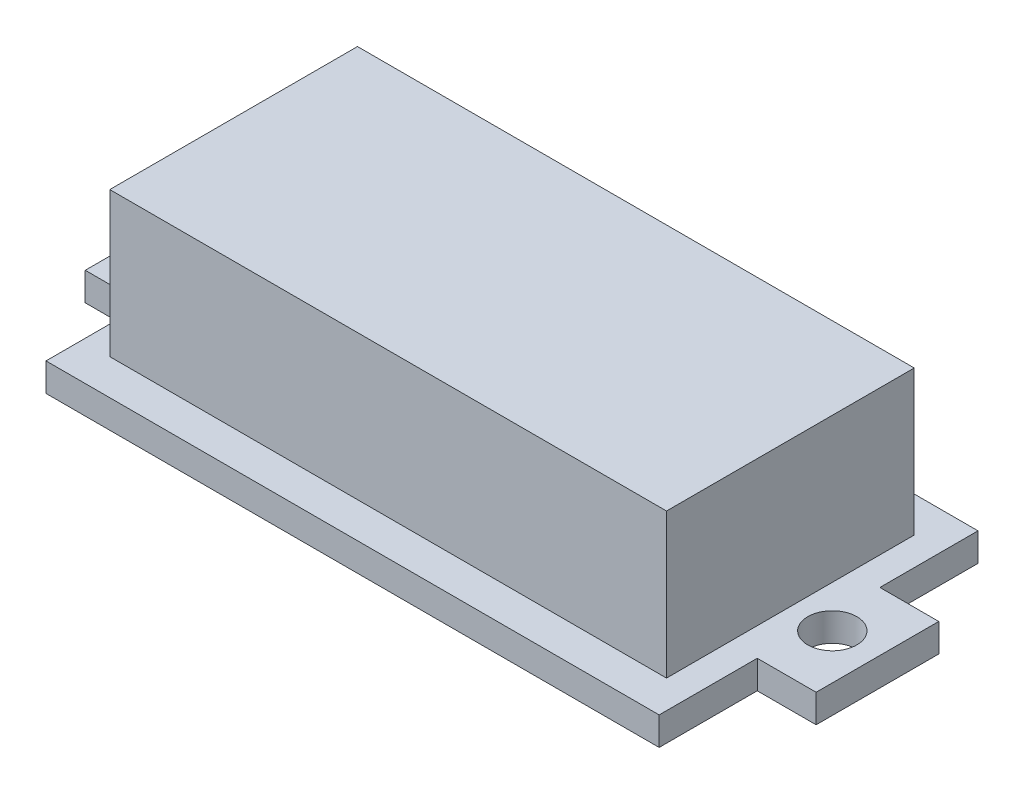
ISO-10303-21;
HEADER;
FILE_DESCRIPTION(('STEP AP214'),'2;1');
FILE_NAME('part.step','',(''),(''),'','','');
FILE_SCHEMA(('AUTOMOTIVE_DESIGN { 1 0 10303 214 1 1 1 1 }'));
ENDSEC;
DATA;
#1=APPLICATION_CONTEXT('core data for automotive mechanical design processes');
#2=APPLICATION_PROTOCOL_DEFINITION('international standard','automotive_design',2000,#1);
#3=PRODUCT_CONTEXT('',#1,'mechanical');
#4=PRODUCT('Part','Part','',(#3));
#5=PRODUCT_RELATED_PRODUCT_CATEGORY('part','',(#4));
#6=PRODUCT_DEFINITION_FORMATION('','',#4);
#7=PRODUCT_DEFINITION_CONTEXT('part definition',#1,'design');
#8=PRODUCT_DEFINITION('design','',#6,#7);
#9=PRODUCT_DEFINITION_SHAPE('','',#8);
#10=(LENGTH_UNIT() NAMED_UNIT(*) SI_UNIT(.MILLI.,.METRE.));
#11=(NAMED_UNIT(*) PLANE_ANGLE_UNIT() SI_UNIT($,.RADIAN.));
#12=(NAMED_UNIT(*) SI_UNIT($,.STERADIAN.) SOLID_ANGLE_UNIT());
#13=UNCERTAINTY_MEASURE_WITH_UNIT(LENGTH_MEASURE(1.E-05),#10,'distance_accuracy_value','');
#14=(GEOMETRIC_REPRESENTATION_CONTEXT(3) GLOBAL_UNCERTAINTY_ASSIGNED_CONTEXT((#13)) GLOBAL_UNIT_ASSIGNED_CONTEXT((#10,
#11,#12)) REPRESENTATION_CONTEXT('',''));
#15=CARTESIAN_POINT('',(0.,0.,0.));
#16=DIRECTION('',(0.,0.,1.));
#17=DIRECTION('',(1.,0.,0.));
#18=AXIS2_PLACEMENT_3D('',#15,#16,#17);
#19=CARTESIAN_POINT('',(0.,1.15,0.));
#20=DIRECTION('',(0.,1.,0.));
#21=DIRECTION('',(0.,0.,1.));
#22=AXIS2_PLACEMENT_3D('',#19,#20,#21);
#23=PLANE('',#22);
#24=DIRECTION('',(0.,0.,-1.));
#25=VECTOR('',#24,1.);
#26=CARTESIAN_POINT('',(11.35,1.15,5.05));
#27=LINE('',#26,#25);
#28=CARTESIAN_POINT('',(11.35,1.15,5.05));
#29=VERTEX_POINT('',#28);
#30=CARTESIAN_POINT('',(11.35,1.15,-5.05));
#31=VERTEX_POINT('',#30);
#32=EDGE_CURVE('E198',#29,#31,#27,.T.);
#33=ORIENTED_EDGE('',*,*,#32,.F.);
#34=DIRECTION('',(1.,0.,0.));
#35=VECTOR('',#34,1.);
#36=CARTESIAN_POINT('',(-11.35,1.15,5.05));
#37=LINE('',#36,#35);
#38=CARTESIAN_POINT('',(-11.35,1.15,5.05));
#39=VERTEX_POINT('',#38);
#40=EDGE_CURVE('E203',#39,#29,#37,.T.);
#41=ORIENTED_EDGE('',*,*,#40,.F.);
#42=DIRECTION('',(0.,0.,1.));
#43=VECTOR('',#42,1.);
#44=CARTESIAN_POINT('',(-11.35,1.15,5.05));
#45=LINE('',#44,#43);
#46=CARTESIAN_POINT('',(-11.35,1.15,-5.05));
#47=VERTEX_POINT('',#46);
#48=EDGE_CURVE('E215',#47,#39,#45,.T.);
#49=ORIENTED_EDGE('',*,*,#48,.F.);
#50=DIRECTION('',(-1.,0.,0.));
#51=VECTOR('',#50,1.);
#52=CARTESIAN_POINT('',(-11.35,1.15,-5.05));
#53=LINE('',#52,#51);
#54=EDGE_CURVE('E212',#31,#47,#53,.T.);
#55=ORIENTED_EDGE('',*,*,#54,.F.);
#56=EDGE_LOOP('',(#33,#41,#49,#55));
#57=FACE_BOUND('',#56,.T.);
#58=CARTESIAN_POINT('',(13.06,1.15,0.));
#59=DIRECTION('',(0.,1.,0.));
#60=DIRECTION('',(0.,0.,1.));
#61=AXIS2_PLACEMENT_3D('',#58,#59,#60);
#62=CIRCLE('',#61,1.);
#63=CARTESIAN_POINT('',(13.06,1.15,1.));
#64=VERTEX_POINT('',#63);
#65=EDGE_CURVE('E238',#64,#64,#62,.T.);
#66=ORIENTED_EDGE('',*,*,#65,.F.);
#67=EDGE_LOOP('',(#66));
#68=FACE_BOUND('',#67,.T.);
#69=DIRECTION('',(0.,0.,-1.));
#70=VECTOR('',#69,1.);
#71=CARTESIAN_POINT('',(12.5,1.15,-6.50000000000001));
#72=LINE('',#71,#70);
#73=CARTESIAN_POINT('',(12.5,1.15,-2.50000000000001));
#74=VERTEX_POINT('',#73);
#75=CARTESIAN_POINT('',(12.5,1.15,-6.50000000000001));
#76=VERTEX_POINT('',#75);
#77=EDGE_CURVE('E244',#74,#76,#72,.T.);
#78=ORIENTED_EDGE('',*,*,#77,.T.);
#79=DIRECTION('',(-1.,0.,0.));
#80=VECTOR('',#79,1.);
#81=CARTESIAN_POINT('',(-12.5,1.15,-6.5));
#82=LINE('',#81,#80);
#83=CARTESIAN_POINT('',(-12.5,1.15,-6.5));
#84=VERTEX_POINT('',#83);
#85=EDGE_CURVE('E247',#76,#84,#82,.T.);
#86=ORIENTED_EDGE('',*,*,#85,.T.);
#87=DIRECTION('',(0.,0.,1.));
#88=VECTOR('',#87,1.);
#89=CARTESIAN_POINT('',(-12.5,1.15,-2.5));
#90=LINE('',#89,#88);
#91=CARTESIAN_POINT('',(-12.5,1.15,-2.5));
#92=VERTEX_POINT('',#91);
#93=EDGE_CURVE('E250',#84,#92,#90,.T.);
#94=ORIENTED_EDGE('',*,*,#93,.T.);
#95=DIRECTION('',(-1.,0.,0.));
#96=VECTOR('',#95,1.);
#97=CARTESIAN_POINT('',(-14.9,1.15,-2.50000000000001));
#98=LINE('',#97,#96);
#99=CARTESIAN_POINT('',(-14.9,1.15,-2.50000000000001));
#100=VERTEX_POINT('',#99);
#101=EDGE_CURVE('E252',#92,#100,#98,.T.);
#102=ORIENTED_EDGE('',*,*,#101,.T.);
#103=DIRECTION('',(0.,0.,1.));
#104=VECTOR('',#103,1.);
#105=CARTESIAN_POINT('',(-14.9,1.15,2.50000000000001));
#106=LINE('',#105,#104);
#107=CARTESIAN_POINT('',(-14.9,1.15,2.50000000000001));
#108=VERTEX_POINT('',#107);
#109=EDGE_CURVE('E254',#100,#108,#106,.T.);
#110=ORIENTED_EDGE('',*,*,#109,.T.);
#111=DIRECTION('',(1.,0.,0.));
#112=VECTOR('',#111,1.);
#113=CARTESIAN_POINT('',(-12.5,1.15,2.5));
#114=LINE('',#113,#112);
#115=CARTESIAN_POINT('',(-12.5,1.15,2.5));
#116=VERTEX_POINT('',#115);
#117=EDGE_CURVE('E256',#108,#116,#114,.T.);
#118=ORIENTED_EDGE('',*,*,#117,.T.);
#119=DIRECTION('',(0.,0.,1.));
#120=VECTOR('',#119,1.);
#121=CARTESIAN_POINT('',(-12.5,1.15,6.5));
#122=LINE('',#121,#120);
#123=CARTESIAN_POINT('',(-12.5,1.15,6.5));
#124=VERTEX_POINT('',#123);
#125=EDGE_CURVE('E258',#116,#124,#122,.T.);
#126=ORIENTED_EDGE('',*,*,#125,.T.);
#127=DIRECTION('',(1.,0.,0.));
#128=VECTOR('',#127,1.);
#129=CARTESIAN_POINT('',(12.5,1.15,6.49999999999999));
#130=LINE('',#129,#128);
#131=CARTESIAN_POINT('',(12.5,1.15,6.49999999999999));
#132=VERTEX_POINT('',#131);
#133=EDGE_CURVE('E260',#124,#132,#130,.T.);
#134=ORIENTED_EDGE('',*,*,#133,.T.);
#135=DIRECTION('',(0.,0.,-1.));
#136=VECTOR('',#135,1.);
#137=CARTESIAN_POINT('',(12.5,1.15,2.5));
#138=LINE('',#137,#136);
#139=CARTESIAN_POINT('',(12.5,1.15,2.5));
#140=VERTEX_POINT('',#139);
#141=EDGE_CURVE('E262',#132,#140,#138,.T.);
#142=ORIENTED_EDGE('',*,*,#141,.T.);
#143=DIRECTION('',(1.,0.,0.));
#144=VECTOR('',#143,1.);
#145=CARTESIAN_POINT('',(14.9,1.15,2.5));
#146=LINE('',#145,#144);
#147=CARTESIAN_POINT('',(14.9,1.15,2.5));
#148=VERTEX_POINT('',#147);
#149=EDGE_CURVE('E264',#140,#148,#146,.T.);
#150=ORIENTED_EDGE('',*,*,#149,.T.);
#151=DIRECTION('',(0.,0.,-1.));
#152=VECTOR('',#151,1.);
#153=CARTESIAN_POINT('',(14.9,1.15,-2.50000000000002));
#154=LINE('',#153,#152);
#155=CARTESIAN_POINT('',(14.9,1.15,-2.50000000000002));
#156=VERTEX_POINT('',#155);
#157=EDGE_CURVE('E266',#148,#156,#154,.T.);
#158=ORIENTED_EDGE('',*,*,#157,.T.);
#159=DIRECTION('',(-1.,0.,0.));
#160=VECTOR('',#159,1.);
#161=CARTESIAN_POINT('',(12.5,1.15,-2.50000000000001));
#162=LINE('',#161,#160);
#163=EDGE_CURVE('E268',#156,#74,#162,.T.);
#164=ORIENTED_EDGE('',*,*,#163,.T.);
#165=EDGE_LOOP('',(#78,#86,#94,#102,#110,#118,#126,#134,#142,#150,#158,#164));
#166=FACE_BOUND('',#165,.T.);
#167=CARTESIAN_POINT('',(-13.06,1.15,0.));
#168=DIRECTION('',(0.,1.,0.));
#169=DIRECTION('',(0.,0.,1.));
#170=AXIS2_PLACEMENT_3D('',#167,#168,#169);
#171=CIRCLE('',#170,1.);
#172=CARTESIAN_POINT('',(-13.06,1.15,1.));
#173=VERTEX_POINT('',#172);
#174=EDGE_CURVE('E232',#173,#173,#171,.T.);
#175=ORIENTED_EDGE('',*,*,#174,.F.);
#176=EDGE_LOOP('',(#175));
#177=FACE_BOUND('',#176,.T.);
#178=ADVANCED_FACE('F34',(#57,#68,#166,#177),#23,.T.);
#179=CARTESIAN_POINT('',(0.,0.,0.));
#180=DIRECTION('',(0.,1.,0.));
#181=DIRECTION('',(0.,0.,1.));
#182=AXIS2_PLACEMENT_3D('',#179,#180,#181);
#183=PLANE('',#182);
#184=DIRECTION('',(-1.,0.,0.));
#185=VECTOR('',#184,1.);
#186=CARTESIAN_POINT('',(0.,0.,-6.));
#187=LINE('',#186,#185);
#188=CARTESIAN_POINT('',(-5.67,0.,-6.));
#189=VERTEX_POINT('',#188);
#190=CARTESIAN_POINT('',(-7.03,0.,-6.));
#191=VERTEX_POINT('',#190);
#192=EDGE_CURVE('E11',#189,#191,#187,.T.);
#193=ORIENTED_EDGE('',*,*,#192,.F.);
#194=DIRECTION('',(0.,0.,-1.));
#195=VECTOR('',#194,1.);
#196=CARTESIAN_POINT('',(-5.67,0.,-6.));
#197=LINE('',#196,#195);
#198=CARTESIAN_POINT('',(-5.67,0.,-6.5));
#199=VERTEX_POINT('',#198);
#200=EDGE_CURVE('E178',#189,#199,#197,.T.);
#201=ORIENTED_EDGE('',*,*,#200,.T.);
#202=DIRECTION('',(-1.,0.,0.));
#203=VECTOR('',#202,1.);
#204=CARTESIAN_POINT('',(-12.5,0.,-6.5));
#205=LINE('',#204,#203);
#206=CARTESIAN_POINT('',(12.5,0.,-6.50000000000001));
#207=VERTEX_POINT('',#206);
#208=EDGE_CURVE('E274',#207,#199,#205,.T.);
#209=ORIENTED_EDGE('',*,*,#208,.F.);
#210=DIRECTION('',(0.,0.,-1.));
#211=VECTOR('',#210,1.);
#212=CARTESIAN_POINT('',(12.5,0.,-6.50000000000001));
#213=LINE('',#212,#211);
#214=CARTESIAN_POINT('',(12.5,0.,-2.50000000000001));
#215=VERTEX_POINT('',#214);
#216=EDGE_CURVE('E241',#215,#207,#213,.T.);
#217=ORIENTED_EDGE('',*,*,#216,.F.);
#218=DIRECTION('',(-1.,0.,0.));
#219=VECTOR('',#218,1.);
#220=CARTESIAN_POINT('',(12.5,0.,-2.50000000000001));
#221=LINE('',#220,#219);
#222=CARTESIAN_POINT('',(14.9,0.,-2.50000000000002));
#223=VERTEX_POINT('',#222);
#224=EDGE_CURVE('E248',#223,#215,#221,.T.);
#225=ORIENTED_EDGE('',*,*,#224,.F.);
#226=DIRECTION('',(0.,0.,-1.));
#227=VECTOR('',#226,1.);
#228=CARTESIAN_POINT('',(14.9,0.,-2.50000000000002));
#229=LINE('',#228,#227);
#230=CARTESIAN_POINT('',(14.9,0.,2.5));
#231=VERTEX_POINT('',#230);
#232=EDGE_CURVE('E293',#231,#223,#229,.T.);
#233=ORIENTED_EDGE('',*,*,#232,.F.);
#234=DIRECTION('',(1.,0.,0.));
#235=VECTOR('',#234,1.);
#236=CARTESIAN_POINT('',(14.9,0.,2.5));
#237=LINE('',#236,#235);
#238=CARTESIAN_POINT('',(12.5,0.,2.5));
#239=VERTEX_POINT('',#238);
#240=EDGE_CURVE('E291',#239,#231,#237,.T.);
#241=ORIENTED_EDGE('',*,*,#240,.F.);
#242=DIRECTION('',(0.,0.,-1.));
#243=VECTOR('',#242,1.);
#244=CARTESIAN_POINT('',(12.5,0.,2.5));
#245=LINE('',#244,#243);
#246=CARTESIAN_POINT('',(12.5,0.,6.49999999999999));
#247=VERTEX_POINT('',#246);
#248=EDGE_CURVE('E289',#247,#239,#245,.T.);
#249=ORIENTED_EDGE('',*,*,#248,.F.);
#250=DIRECTION('',(1.,0.,0.));
#251=VECTOR('',#250,1.);
#252=CARTESIAN_POINT('',(12.5,0.,6.49999999999999));
#253=LINE('',#252,#251);
#254=CARTESIAN_POINT('',(-12.5,0.,6.5));
#255=VERTEX_POINT('',#254);
#256=EDGE_CURVE('E287',#255,#247,#253,.T.);
#257=ORIENTED_EDGE('',*,*,#256,.F.);
#258=DIRECTION('',(0.,0.,1.));
#259=VECTOR('',#258,1.);
#260=CARTESIAN_POINT('',(-12.5,0.,6.5));
#261=LINE('',#260,#259);
#262=CARTESIAN_POINT('',(-12.5,0.,2.5));
#263=VERTEX_POINT('',#262);
#264=EDGE_CURVE('E285',#263,#255,#261,.T.);
#265=ORIENTED_EDGE('',*,*,#264,.F.);
#266=DIRECTION('',(1.,0.,0.));
#267=VECTOR('',#266,1.);
#268=CARTESIAN_POINT('',(-12.5,0.,2.5));
#269=LINE('',#268,#267);
#270=CARTESIAN_POINT('',(-14.9,0.,2.50000000000001));
#271=VERTEX_POINT('',#270);
#272=EDGE_CURVE('E283',#271,#263,#269,.T.);
#273=ORIENTED_EDGE('',*,*,#272,.F.);
#274=DIRECTION('',(0.,0.,1.));
#275=VECTOR('',#274,1.);
#276=CARTESIAN_POINT('',(-14.9,0.,2.50000000000001));
#277=LINE('',#276,#275);
#278=CARTESIAN_POINT('',(-14.9,0.,-2.50000000000001));
#279=VERTEX_POINT('',#278);
#280=EDGE_CURVE('E281',#279,#271,#277,.T.);
#281=ORIENTED_EDGE('',*,*,#280,.F.);
#282=DIRECTION('',(-1.,0.,0.));
#283=VECTOR('',#282,1.);
#284=CARTESIAN_POINT('',(-14.9,0.,-2.50000000000001));
#285=LINE('',#284,#283);
#286=CARTESIAN_POINT('',(-12.5,0.,-2.5));
#287=VERTEX_POINT('',#286);
#288=EDGE_CURVE('E279',#287,#279,#285,.T.);
#289=ORIENTED_EDGE('',*,*,#288,.F.);
#290=DIRECTION('',(0.,0.,1.));
#291=VECTOR('',#290,1.);
#292=CARTESIAN_POINT('',(-12.5,0.,-2.5));
#293=LINE('',#292,#291);
#294=CARTESIAN_POINT('',(-12.5,0.,-6.5));
#295=VERTEX_POINT('',#294);
#296=EDGE_CURVE('E277',#295,#287,#293,.T.);
#297=ORIENTED_EDGE('',*,*,#296,.F.);
#298=CARTESIAN_POINT('',(-9.53,0.,-6.5));
#299=VERTEX_POINT('',#298);
#300=EDGE_CURVE('E273',#299,#295,#205,.T.);
#301=ORIENTED_EDGE('',*,*,#300,.F.);
#302=DIRECTION('',(0.,0.,-1.));
#303=VECTOR('',#302,1.);
#304=CARTESIAN_POINT('',(-9.53,0.,-6.));
#305=LINE('',#304,#303);
#306=CARTESIAN_POINT('',(-9.53,0.,-6.));
#307=VERTEX_POINT('',#306);
#308=EDGE_CURVE('E57',#299,#307,#305,.F.);
#309=ORIENTED_EDGE('',*,*,#308,.T.);
#310=DIRECTION('',(-1.,0.,0.));
#311=VECTOR('',#310,1.);
#312=CARTESIAN_POINT('',(0.,0.,-6.));
#313=LINE('',#312,#311);
#314=CARTESIAN_POINT('',(-8.17,0.,-6.));
#315=VERTEX_POINT('',#314);
#316=EDGE_CURVE('E333',#315,#307,#313,.T.);
#317=ORIENTED_EDGE('',*,*,#316,.F.);
#318=DIRECTION('',(0.,0.,-1.));
#319=VECTOR('',#318,1.);
#320=CARTESIAN_POINT('',(-8.17,0.,-6.));
#321=LINE('',#320,#319);
#322=CARTESIAN_POINT('',(-8.17,0.,-6.5));
#323=VERTEX_POINT('',#322);
#324=EDGE_CURVE('E196',#315,#323,#321,.T.);
#325=ORIENTED_EDGE('',*,*,#324,.T.);
#326=CARTESIAN_POINT('',(-7.03,0.,-6.5));
#327=VERTEX_POINT('',#326);
#328=EDGE_CURVE('E185',#327,#323,#205,.T.);
#329=ORIENTED_EDGE('',*,*,#328,.F.);
#330=DIRECTION('',(0.,0.,-1.));
#331=VECTOR('',#330,1.);
#332=CARTESIAN_POINT('',(-7.03,0.,-6.));
#333=LINE('',#332,#331);
#334=EDGE_CURVE('E49',#327,#191,#333,.F.);
#335=ORIENTED_EDGE('',*,*,#334,.T.);
#336=EDGE_LOOP('',(#193,#201,#209,#217,#225,#233,#241,#249,#257,#265,#273,#281,#289,#297,#301,
#309,#317,#325,#329,#335));
#337=FACE_BOUND('',#336,.T.);
#338=CARTESIAN_POINT('',(13.06,0.,0.));
#339=DIRECTION('',(0.,1.,0.));
#340=DIRECTION('',(0.,0.,1.));
#341=AXIS2_PLACEMENT_3D('',#338,#339,#340);
#342=CIRCLE('',#341,1.);
#343=CARTESIAN_POINT('',(13.06,0.,1.));
#344=VERTEX_POINT('',#343);
#345=EDGE_CURVE('E235',#344,#344,#342,.T.);
#346=ORIENTED_EDGE('',*,*,#345,.T.);
#347=EDGE_LOOP('',(#346));
#348=FACE_BOUND('',#347,.T.);
#349=CARTESIAN_POINT('',(-13.06,0.,0.));
#350=DIRECTION('',(0.,1.,0.));
#351=DIRECTION('',(0.,0.,1.));
#352=AXIS2_PLACEMENT_3D('',#349,#350,#351);
#353=CIRCLE('',#352,1.);
#354=CARTESIAN_POINT('',(-13.06,0.,1.));
#355=VERTEX_POINT('',#354);
#356=EDGE_CURVE('E231',#355,#355,#353,.T.);
#357=ORIENTED_EDGE('',*,*,#356,.T.);
#358=EDGE_LOOP('',(#357));
#359=FACE_BOUND('',#358,.T.);
#360=ADVANCED_FACE('F182',(#337,#348,#359),#183,.F.);
#361=CARTESIAN_POINT('',(12.5,1.15,-6.50000000000001));
#362=DIRECTION('',(-1.,0.,0.));
#363=DIRECTION('',(0.,0.,1.));
#364=AXIS2_PLACEMENT_3D('',#361,#362,#363);
#365=PLANE('',#364);
#366=ORIENTED_EDGE('',*,*,#216,.T.);
#367=DIRECTION('',(0.,-1.,0.));
#368=VECTOR('',#367,1.);
#369=CARTESIAN_POINT('',(12.5,1.15,-6.50000000000001));
#370=LINE('',#369,#368);
#371=EDGE_CURVE('E328',#76,#207,#370,.T.);
#372=ORIENTED_EDGE('',*,*,#371,.F.);
#373=ORIENTED_EDGE('',*,*,#77,.F.);
#374=DIRECTION('',(0.,-1.,0.));
#375=VECTOR('',#374,1.);
#376=CARTESIAN_POINT('',(12.5,1.15,-2.50000000000001));
#377=LINE('',#376,#375);
#378=EDGE_CURVE('E270',#74,#215,#377,.T.);
#379=ORIENTED_EDGE('',*,*,#378,.T.);
#380=EDGE_LOOP('',(#366,#372,#373,#379));
#381=FACE_BOUND('',#380,.T.);
#382=ADVANCED_FACE('F36',(#381),#365,.F.);
#383=CARTESIAN_POINT('',(-12.5,1.15,-6.5));
#384=DIRECTION('',(0.,0.,1.));
#385=DIRECTION('',(1.,0.,0.));
#386=AXIS2_PLACEMENT_3D('',#383,#384,#385);
#387=PLANE('',#386);
#388=ORIENTED_EDGE('',*,*,#208,.T.);
#389=CARTESIAN_POINT('',(-6.35,0.,-6.5));
#390=DIRECTION('',(0.,0.,1.));
#391=DIRECTION('',(1.,0.,0.));
#392=AXIS2_PLACEMENT_3D('',#389,#390,#391);
#393=CIRCLE('',#392,0.679999999999999);
#394=EDGE_CURVE('E42',#199,#327,#393,.T.);
#395=ORIENTED_EDGE('',*,*,#394,.T.);
#396=ORIENTED_EDGE('',*,*,#328,.T.);
#397=CARTESIAN_POINT('',(-8.85,0.,-6.5));
#398=DIRECTION('',(0.,0.,1.));
#399=DIRECTION('',(1.,0.,0.));
#400=AXIS2_PLACEMENT_3D('',#397,#398,#399);
#401=CIRCLE('',#400,0.679999999999999);
#402=EDGE_CURVE('E331',#323,#299,#401,.T.);
#403=ORIENTED_EDGE('',*,*,#402,.T.);
#404=ORIENTED_EDGE('',*,*,#300,.T.);
#405=DIRECTION('',(0.,-1.,0.));
#406=VECTOR('',#405,1.);
#407=CARTESIAN_POINT('',(-12.5,1.15,-6.5));
#408=LINE('',#407,#406);
#409=EDGE_CURVE('E325',#84,#295,#408,.T.);
#410=ORIENTED_EDGE('',*,*,#409,.F.);
#411=ORIENTED_EDGE('',*,*,#85,.F.);
#412=ORIENTED_EDGE('',*,*,#371,.T.);
#413=EDGE_LOOP('',(#388,#395,#396,#403,#404,#410,#411,#412));
#414=FACE_BOUND('',#413,.T.);
#415=ADVANCED_FACE('F335',(#414),#387,.F.);
#416=CARTESIAN_POINT('',(-12.5,1.15,-2.5));
#417=DIRECTION('',(1.,0.,0.));
#418=DIRECTION('',(0.,0.,-1.));
#419=AXIS2_PLACEMENT_3D('',#416,#417,#418);
#420=PLANE('',#419);
#421=ORIENTED_EDGE('',*,*,#296,.T.);
#422=DIRECTION('',(0.,-1.,0.));
#423=VECTOR('',#422,1.);
#424=CARTESIAN_POINT('',(-12.5,1.15,-2.5));
#425=LINE('',#424,#423);
#426=EDGE_CURVE('E322',#92,#287,#425,.T.);
#427=ORIENTED_EDGE('',*,*,#426,.F.);
#428=ORIENTED_EDGE('',*,*,#93,.F.);
#429=ORIENTED_EDGE('',*,*,#409,.T.);
#430=EDGE_LOOP('',(#421,#427,#428,#429));
#431=FACE_BOUND('',#430,.T.);
#432=ADVANCED_FACE('F390',(#431),#420,.F.);
#433=CARTESIAN_POINT('',(-14.9,1.15,-2.50000000000001));
#434=DIRECTION('',(0.,0.,1.));
#435=DIRECTION('',(1.,0.,0.));
#436=AXIS2_PLACEMENT_3D('',#433,#434,#435);
#437=PLANE('',#436);
#438=ORIENTED_EDGE('',*,*,#288,.T.);
#439=DIRECTION('',(0.,-1.,0.));
#440=VECTOR('',#439,1.);
#441=CARTESIAN_POINT('',(-14.9,1.15,-2.50000000000001));
#442=LINE('',#441,#440);
#443=EDGE_CURVE('E319',#100,#279,#442,.T.);
#444=ORIENTED_EDGE('',*,*,#443,.F.);
#445=ORIENTED_EDGE('',*,*,#101,.F.);
#446=ORIENTED_EDGE('',*,*,#426,.T.);
#447=EDGE_LOOP('',(#438,#444,#445,#446));
#448=FACE_BOUND('',#447,.T.);
#449=ADVANCED_FACE('F386',(#448),#437,.F.);
#450=CARTESIAN_POINT('',(-14.9,1.15,2.50000000000001));
#451=DIRECTION('',(1.,0.,0.));
#452=DIRECTION('',(0.,0.,-1.));
#453=AXIS2_PLACEMENT_3D('',#450,#451,#452);
#454=PLANE('',#453);
#455=ORIENTED_EDGE('',*,*,#280,.T.);
#456=DIRECTION('',(0.,-1.,0.));
#457=VECTOR('',#456,1.);
#458=CARTESIAN_POINT('',(-14.9,1.15,2.50000000000001));
#459=LINE('',#458,#457);
#460=EDGE_CURVE('E316',#108,#271,#459,.T.);
#461=ORIENTED_EDGE('',*,*,#460,.F.);
#462=ORIENTED_EDGE('',*,*,#109,.F.);
#463=ORIENTED_EDGE('',*,*,#443,.T.);
#464=EDGE_LOOP('',(#455,#461,#462,#463));
#465=FACE_BOUND('',#464,.T.);
#466=ADVANCED_FACE('F381',(#465),#454,.F.);
#467=CARTESIAN_POINT('',(-12.5,1.15,2.5));
#468=DIRECTION('',(0.,0.,-1.));
#469=DIRECTION('',(-1.,0.,0.));
#470=AXIS2_PLACEMENT_3D('',#467,#468,#469);
#471=PLANE('',#470);
#472=ORIENTED_EDGE('',*,*,#272,.T.);
#473=DIRECTION('',(0.,-1.,0.));
#474=VECTOR('',#473,1.);
#475=CARTESIAN_POINT('',(-12.5,1.15,2.5));
#476=LINE('',#475,#474);
#477=EDGE_CURVE('E313',#116,#263,#476,.T.);
#478=ORIENTED_EDGE('',*,*,#477,.F.);
#479=ORIENTED_EDGE('',*,*,#117,.F.);
#480=ORIENTED_EDGE('',*,*,#460,.T.);
#481=EDGE_LOOP('',(#472,#478,#479,#480));
#482=FACE_BOUND('',#481,.T.);
#483=ADVANCED_FACE('F375',(#482),#471,.F.);
#484=CARTESIAN_POINT('',(-12.5,1.15,6.5));
#485=DIRECTION('',(1.,0.,0.));
#486=DIRECTION('',(0.,0.,-1.));
#487=AXIS2_PLACEMENT_3D('',#484,#485,#486);
#488=PLANE('',#487);
#489=ORIENTED_EDGE('',*,*,#264,.T.);
#490=DIRECTION('',(0.,-1.,0.));
#491=VECTOR('',#490,1.);
#492=CARTESIAN_POINT('',(-12.5,1.15,6.5));
#493=LINE('',#492,#491);
#494=EDGE_CURVE('E310',#124,#255,#493,.T.);
#495=ORIENTED_EDGE('',*,*,#494,.F.);
#496=ORIENTED_EDGE('',*,*,#125,.F.);
#497=ORIENTED_EDGE('',*,*,#477,.T.);
#498=EDGE_LOOP('',(#489,#495,#496,#497));
#499=FACE_BOUND('',#498,.T.);
#500=ADVANCED_FACE('F371',(#499),#488,.F.);
#501=CARTESIAN_POINT('',(12.5,1.15,6.49999999999999));
#502=DIRECTION('',(0.,0.,-1.));
#503=DIRECTION('',(-1.,0.,0.));
#504=AXIS2_PLACEMENT_3D('',#501,#502,#503);
#505=PLANE('',#504);
#506=ORIENTED_EDGE('',*,*,#256,.T.);
#507=DIRECTION('',(0.,-1.,0.));
#508=VECTOR('',#507,1.);
#509=CARTESIAN_POINT('',(12.5,1.15,6.49999999999999));
#510=LINE('',#509,#508);
#511=EDGE_CURVE('E307',#132,#247,#510,.T.);
#512=ORIENTED_EDGE('',*,*,#511,.F.);
#513=ORIENTED_EDGE('',*,*,#133,.F.);
#514=ORIENTED_EDGE('',*,*,#494,.T.);
#515=EDGE_LOOP('',(#506,#512,#513,#514));
#516=FACE_BOUND('',#515,.T.);
#517=ADVANCED_FACE('F366',(#516),#505,.F.);
#518=CARTESIAN_POINT('',(12.5,1.15,2.5));
#519=DIRECTION('',(-1.,0.,0.));
#520=DIRECTION('',(0.,0.,1.));
#521=AXIS2_PLACEMENT_3D('',#518,#519,#520);
#522=PLANE('',#521);
#523=ORIENTED_EDGE('',*,*,#248,.T.);
#524=DIRECTION('',(0.,-1.,0.));
#525=VECTOR('',#524,1.);
#526=CARTESIAN_POINT('',(12.5,1.15,2.5));
#527=LINE('',#526,#525);
#528=EDGE_CURVE('E304',#140,#239,#527,.T.);
#529=ORIENTED_EDGE('',*,*,#528,.F.);
#530=ORIENTED_EDGE('',*,*,#141,.F.);
#531=ORIENTED_EDGE('',*,*,#511,.T.);
#532=EDGE_LOOP('',(#523,#529,#530,#531));
#533=FACE_BOUND('',#532,.T.);
#534=ADVANCED_FACE('F360',(#533),#522,.F.);
#535=CARTESIAN_POINT('',(14.9,1.15,2.5));
#536=DIRECTION('',(0.,0.,-1.));
#537=DIRECTION('',(-1.,0.,0.));
#538=AXIS2_PLACEMENT_3D('',#535,#536,#537);
#539=PLANE('',#538);
#540=ORIENTED_EDGE('',*,*,#240,.T.);
#541=DIRECTION('',(0.,-1.,0.));
#542=VECTOR('',#541,1.);
#543=CARTESIAN_POINT('',(14.9,1.15,2.5));
#544=LINE('',#543,#542);
#545=EDGE_CURVE('E301',#148,#231,#544,.T.);
#546=ORIENTED_EDGE('',*,*,#545,.F.);
#547=ORIENTED_EDGE('',*,*,#149,.F.);
#548=ORIENTED_EDGE('',*,*,#528,.T.);
#549=EDGE_LOOP('',(#540,#546,#547,#548));
#550=FACE_BOUND('',#549,.T.);
#551=ADVANCED_FACE('F356',(#550),#539,.F.);
#552=CARTESIAN_POINT('',(14.9,1.15,-2.50000000000002));
#553=DIRECTION('',(-1.,0.,0.));
#554=DIRECTION('',(0.,0.,1.));
#555=AXIS2_PLACEMENT_3D('',#552,#553,#554);
#556=PLANE('',#555);
#557=ORIENTED_EDGE('',*,*,#232,.T.);
#558=DIRECTION('',(0.,-1.,0.));
#559=VECTOR('',#558,1.);
#560=CARTESIAN_POINT('',(14.9,1.15,-2.50000000000002));
#561=LINE('',#560,#559);
#562=EDGE_CURVE('E298',#156,#223,#561,.T.);
#563=ORIENTED_EDGE('',*,*,#562,.F.);
#564=ORIENTED_EDGE('',*,*,#157,.F.);
#565=ORIENTED_EDGE('',*,*,#545,.T.);
#566=EDGE_LOOP('',(#557,#563,#564,#565));
#567=FACE_BOUND('',#566,.T.);
#568=ADVANCED_FACE('F351',(#567),#556,.F.);
#569=CARTESIAN_POINT('',(12.5,1.15,-2.50000000000001));
#570=DIRECTION('',(0.,0.,1.));
#571=DIRECTION('',(1.,0.,0.));
#572=AXIS2_PLACEMENT_3D('',#569,#570,#571);
#573=PLANE('',#572);
#574=ORIENTED_EDGE('',*,*,#224,.T.);
#575=ORIENTED_EDGE('',*,*,#378,.F.);
#576=ORIENTED_EDGE('',*,*,#163,.F.);
#577=ORIENTED_EDGE('',*,*,#562,.T.);
#578=EDGE_LOOP('',(#574,#575,#576,#577));
#579=FACE_BOUND('',#578,.T.);
#580=ADVANCED_FACE('F345',(#579),#573,.F.);
#581=CARTESIAN_POINT('',(13.06,1.15,0.));
#582=DIRECTION('',(0.,-1.,0.));
#583=DIRECTION('',(0.,0.,-1.));
#584=AXIS2_PLACEMENT_3D('',#581,#582,#583);
#585=CYLINDRICAL_SURFACE('',#584,1.);
#586=ORIENTED_EDGE('',*,*,#65,.T.);
#587=EDGE_LOOP('',(#586));
#588=FACE_BOUND('',#587,.T.);
#589=ORIENTED_EDGE('',*,*,#345,.F.);
#590=EDGE_LOOP('',(#589));
#591=FACE_BOUND('',#590,.T.);
#592=ADVANCED_FACE('F420',(#588,#591),#585,.F.);
#593=CARTESIAN_POINT('',(-13.06,1.15,0.));
#594=DIRECTION('',(0.,-1.,0.));
#595=DIRECTION('',(0.,0.,-1.));
#596=AXIS2_PLACEMENT_3D('',#593,#594,#595);
#597=CYLINDRICAL_SURFACE('',#596,1.);
#598=ORIENTED_EDGE('',*,*,#174,.T.);
#599=EDGE_LOOP('',(#598));
#600=FACE_BOUND('',#599,.T.);
#601=ORIENTED_EDGE('',*,*,#356,.F.);
#602=EDGE_LOOP('',(#601));
#603=FACE_BOUND('',#602,.T.);
#604=ADVANCED_FACE('F550',(#600,#603),#597,.F.);
#605=CARTESIAN_POINT('',(11.35,7.05,5.05));
#606=DIRECTION('',(-1.,0.,0.));
#607=DIRECTION('',(0.,0.,1.));
#608=AXIS2_PLACEMENT_3D('',#605,#606,#607);
#609=PLANE('',#608);
#610=ORIENTED_EDGE('',*,*,#32,.T.);
#611=DIRECTION('',(0.,-1.,0.));
#612=VECTOR('',#611,1.);
#613=CARTESIAN_POINT('',(11.35,7.05,-5.05));
#614=LINE('',#613,#612);
#615=CARTESIAN_POINT('',(11.35,7.05,-5.05));
#616=VERTEX_POINT('',#615);
#617=EDGE_CURVE('E228',#616,#31,#614,.T.);
#618=ORIENTED_EDGE('',*,*,#617,.F.);
#619=DIRECTION('',(0.,0.,-1.));
#620=VECTOR('',#619,1.);
#621=CARTESIAN_POINT('',(11.35,7.05,5.05));
#622=LINE('',#621,#620);
#623=CARTESIAN_POINT('',(11.35,7.05,5.05));
#624=VERTEX_POINT('',#623);
#625=EDGE_CURVE('E199',#624,#616,#622,.T.);
#626=ORIENTED_EDGE('',*,*,#625,.F.);
#627=DIRECTION('',(0.,-1.,0.));
#628=VECTOR('',#627,1.);
#629=CARTESIAN_POINT('',(11.35,7.05,5.05));
#630=LINE('',#629,#628);
#631=EDGE_CURVE('E209',#624,#29,#630,.T.);
#632=ORIENTED_EDGE('',*,*,#631,.T.);
#633=EDGE_LOOP('',(#610,#618,#626,#632));
#634=FACE_BOUND('',#633,.T.);
#635=ADVANCED_FACE('F541',(#634),#609,.F.);
#636=CARTESIAN_POINT('',(-11.35,7.05,-5.05));
#637=DIRECTION('',(0.,0.,1.));
#638=DIRECTION('',(1.,0.,0.));
#639=AXIS2_PLACEMENT_3D('',#636,#637,#638);
#640=PLANE('',#639);
#641=ORIENTED_EDGE('',*,*,#54,.T.);
#642=DIRECTION('',(0.,-1.,0.));
#643=VECTOR('',#642,1.);
#644=CARTESIAN_POINT('',(-11.35,7.05,-5.05));
#645=LINE('',#644,#643);
#646=CARTESIAN_POINT('',(-11.35,7.05,-5.05));
#647=VERTEX_POINT('',#646);
#648=EDGE_CURVE('E225',#647,#47,#645,.T.);
#649=ORIENTED_EDGE('',*,*,#648,.F.);
#650=DIRECTION('',(-1.,0.,0.));
#651=VECTOR('',#650,1.);
#652=CARTESIAN_POINT('',(-11.35,7.05,-5.05));
#653=LINE('',#652,#651);
#654=EDGE_CURVE('E202',#616,#647,#653,.T.);
#655=ORIENTED_EDGE('',*,*,#654,.F.);
#656=ORIENTED_EDGE('',*,*,#617,.T.);
#657=EDGE_LOOP('',(#641,#649,#655,#656));
#658=FACE_BOUND('',#657,.T.);
#659=ADVANCED_FACE('F532',(#658),#640,.F.);
#660=CARTESIAN_POINT('',(-11.35,7.05,5.05));
#661=DIRECTION('',(1.,0.,0.));
#662=DIRECTION('',(0.,0.,-1.));
#663=AXIS2_PLACEMENT_3D('',#660,#661,#662);
#664=PLANE('',#663);
#665=ORIENTED_EDGE('',*,*,#48,.T.);
#666=DIRECTION('',(0.,-1.,0.));
#667=VECTOR('',#666,1.);
#668=CARTESIAN_POINT('',(-11.35,7.05,5.05));
#669=LINE('',#668,#667);
#670=CARTESIAN_POINT('',(-11.35,7.05,5.05));
#671=VERTEX_POINT('',#670);
#672=EDGE_CURVE('E222',#671,#39,#669,.T.);
#673=ORIENTED_EDGE('',*,*,#672,.F.);
#674=DIRECTION('',(0.,0.,1.));
#675=VECTOR('',#674,1.);
#676=CARTESIAN_POINT('',(-11.35,7.05,5.05));
#677=LINE('',#676,#675);
#678=EDGE_CURVE('E205',#647,#671,#677,.T.);
#679=ORIENTED_EDGE('',*,*,#678,.F.);
#680=ORIENTED_EDGE('',*,*,#648,.T.);
#681=EDGE_LOOP('',(#665,#673,#679,#680));
#682=FACE_BOUND('',#681,.T.);
#683=ADVANCED_FACE('F523',(#682),#664,.F.);
#684=CARTESIAN_POINT('',(-11.35,7.05,5.05));
#685=DIRECTION('',(0.,0.,-1.));
#686=DIRECTION('',(-1.,0.,0.));
#687=AXIS2_PLACEMENT_3D('',#684,#685,#686);
#688=PLANE('',#687);
#689=ORIENTED_EDGE('',*,*,#40,.T.);
#690=ORIENTED_EDGE('',*,*,#631,.F.);
#691=DIRECTION('',(1.,0.,0.));
#692=VECTOR('',#691,1.);
#693=CARTESIAN_POINT('',(-11.35,7.05,5.05));
#694=LINE('',#693,#692);
#695=EDGE_CURVE('E207',#671,#624,#694,.T.);
#696=ORIENTED_EDGE('',*,*,#695,.F.);
#697=ORIENTED_EDGE('',*,*,#672,.T.);
#698=EDGE_LOOP('',(#689,#690,#696,#697));
#699=FACE_BOUND('',#698,.T.);
#700=ADVANCED_FACE('F407',(#699),#688,.F.);
#701=CARTESIAN_POINT('',(0.,7.05,0.));
#702=DIRECTION('',(0.,-1.,0.));
#703=DIRECTION('',(0.,0.,-1.));
#704=AXIS2_PLACEMENT_3D('',#701,#702,#703);
#705=PLANE('',#704);
#706=ORIENTED_EDGE('',*,*,#625,.T.);
#707=ORIENTED_EDGE('',*,*,#654,.T.);
#708=ORIENTED_EDGE('',*,*,#678,.T.);
#709=ORIENTED_EDGE('',*,*,#695,.T.);
#710=EDGE_LOOP('',(#706,#707,#708,#709));
#711=FACE_BOUND('',#710,.T.);
#712=ADVANCED_FACE('F398',(#711),#705,.F.);
#713=CARTESIAN_POINT('',(-8.85,0.,-6.));
#714=DIRECTION('',(0.,0.,-1.));
#715=DIRECTION('',(-1.,0.,0.));
#716=AXIS2_PLACEMENT_3D('',#713,#714,#715);
#717=PLANE('',#716);
#718=CARTESIAN_POINT('',(-8.85,0.,-6.));
#719=DIRECTION('',(0.,0.,-1.));
#720=DIRECTION('',(-1.,0.,0.));
#721=AXIS2_PLACEMENT_3D('',#718,#719,#720);
#722=CIRCLE('',#721,0.679999999999999);
#723=EDGE_CURVE('E193',#315,#307,#722,.T.);
#724=ORIENTED_EDGE('',*,*,#723,.F.);
#725=ORIENTED_EDGE('',*,*,#316,.T.);
#726=EDGE_LOOP('',(#724,#725));
#727=FACE_BOUND('',#726,.T.);
#728=ADVANCED_FACE('F396',(#727),#717,.F.);
#729=CARTESIAN_POINT('',(-8.85,0.,-6.));
#730=DIRECTION('',(0.,0.,-1.));
#731=DIRECTION('',(-1.,0.,0.));
#732=AXIS2_PLACEMENT_3D('',#729,#730,#731);
#733=CYLINDRICAL_SURFACE('',#732,0.679999999999999);
#734=CARTESIAN_POINT('',(-8.85,0.,-8.5));
#735=DIRECTION('',(0.,0.,-1.));
#736=DIRECTION('',(-1.,0.,0.));
#737=AXIS2_PLACEMENT_3D('',#734,#735,#736);
#738=CIRCLE('',#737,0.679999999999999);
#739=CARTESIAN_POINT('',(-9.53,0.,-8.5));
#740=VERTEX_POINT('',#739);
#741=EDGE_CURVE('E187',#740,#740,#738,.T.);
#742=ORIENTED_EDGE('',*,*,#741,.F.);
#743=EDGE_LOOP('',(#742));
#744=FACE_BOUND('',#743,.T.);
#745=ORIENTED_EDGE('',*,*,#324,.F.);
#746=ORIENTED_EDGE('',*,*,#723,.T.);
#747=ORIENTED_EDGE('',*,*,#308,.F.);
#748=ORIENTED_EDGE('',*,*,#402,.F.);
#749=EDGE_LOOP('',(#745,#746,#747,#748));
#750=FACE_BOUND('',#749,.T.);
#751=ADVANCED_FACE('F393',(#744,#750),#733,.T.);
#752=CARTESIAN_POINT('',(-8.85,0.,-8.5));
#753=DIRECTION('',(0.,0.,-1.));
#754=DIRECTION('',(-1.,0.,0.));
#755=AXIS2_PLACEMENT_3D('',#752,#753,#754);
#756=PLANE('',#755);
#757=ORIENTED_EDGE('',*,*,#741,.T.);
#758=EDGE_LOOP('',(#757));
#759=FACE_BOUND('',#758,.T.);
#760=ADVANCED_FACE('F404',(#759),#756,.T.);
#761=CARTESIAN_POINT('',(-6.35,0.,-6.));
#762=DIRECTION('',(0.,0.,-1.));
#763=DIRECTION('',(-1.,0.,0.));
#764=AXIS2_PLACEMENT_3D('',#761,#762,#763);
#765=PLANE('',#764);
#766=CARTESIAN_POINT('',(-6.35,0.,-6.));
#767=DIRECTION('',(0.,0.,-1.));
#768=DIRECTION('',(-1.,0.,0.));
#769=AXIS2_PLACEMENT_3D('',#766,#767,#768);
#770=CIRCLE('',#769,0.679999999999999);
#771=EDGE_CURVE('E174',#189,#191,#770,.T.);
#772=ORIENTED_EDGE('',*,*,#771,.F.);
#773=ORIENTED_EDGE('',*,*,#192,.T.);
#774=EDGE_LOOP('',(#772,#773));
#775=FACE_BOUND('',#774,.T.);
#776=ADVANCED_FACE('F173',(#775),#765,.F.);
#777=CARTESIAN_POINT('',(-6.35,0.,-6.));
#778=DIRECTION('',(0.,0.,-1.));
#779=DIRECTION('',(-1.,0.,0.));
#780=AXIS2_PLACEMENT_3D('',#777,#778,#779);
#781=CYLINDRICAL_SURFACE('',#780,0.679999999999999);
#782=CARTESIAN_POINT('',(-6.35,0.,-8.5));
#783=DIRECTION('',(0.,0.,-1.));
#784=DIRECTION('',(-1.,0.,0.));
#785=AXIS2_PLACEMENT_3D('',#782,#783,#784);
#786=CIRCLE('',#785,0.679999999999999);
#787=CARTESIAN_POINT('',(-7.03,0.,-8.5));
#788=VERTEX_POINT('',#787);
#789=EDGE_CURVE('E179',#788,#788,#786,.T.);
#790=ORIENTED_EDGE('',*,*,#789,.F.);
#791=EDGE_LOOP('',(#790));
#792=FACE_BOUND('',#791,.T.);
#793=ORIENTED_EDGE('',*,*,#200,.F.);
#794=ORIENTED_EDGE('',*,*,#771,.T.);
#795=ORIENTED_EDGE('',*,*,#334,.F.);
#796=ORIENTED_EDGE('',*,*,#394,.F.);
#797=EDGE_LOOP('',(#793,#794,#795,#796));
#798=FACE_BOUND('',#797,.T.);
#799=ADVANCED_FACE('F177',(#792,#798),#781,.T.);
#800=CARTESIAN_POINT('',(-6.35,0.,-8.5));
#801=DIRECTION('',(0.,0.,-1.));
#802=DIRECTION('',(-1.,0.,0.));
#803=AXIS2_PLACEMENT_3D('',#800,#801,#802);
#804=PLANE('',#803);
#805=ORIENTED_EDGE('',*,*,#789,.T.);
#806=EDGE_LOOP('',(#805));
#807=FACE_BOUND('',#806,.T.);
#808=ADVANCED_FACE('F499',(#807),#804,.T.);
#809=CLOSED_SHELL('',(#178,#360,#382,#415,#432,#449,#466,#483,#500,#517,#534,#551,#568,#580,
#592,#604,#635,#659,#683,#700,#712,#728,#751,#760,#776,#799,#808));
#810=MANIFOLD_SOLID_BREP('B2',#809);
#811=ADVANCED_BREP_SHAPE_REPRESENTATION('',(#18,#810),#14);
#812=SHAPE_DEFINITION_REPRESENTATION(#9,#811);
ENDSEC;
END-ISO-10303-21;
